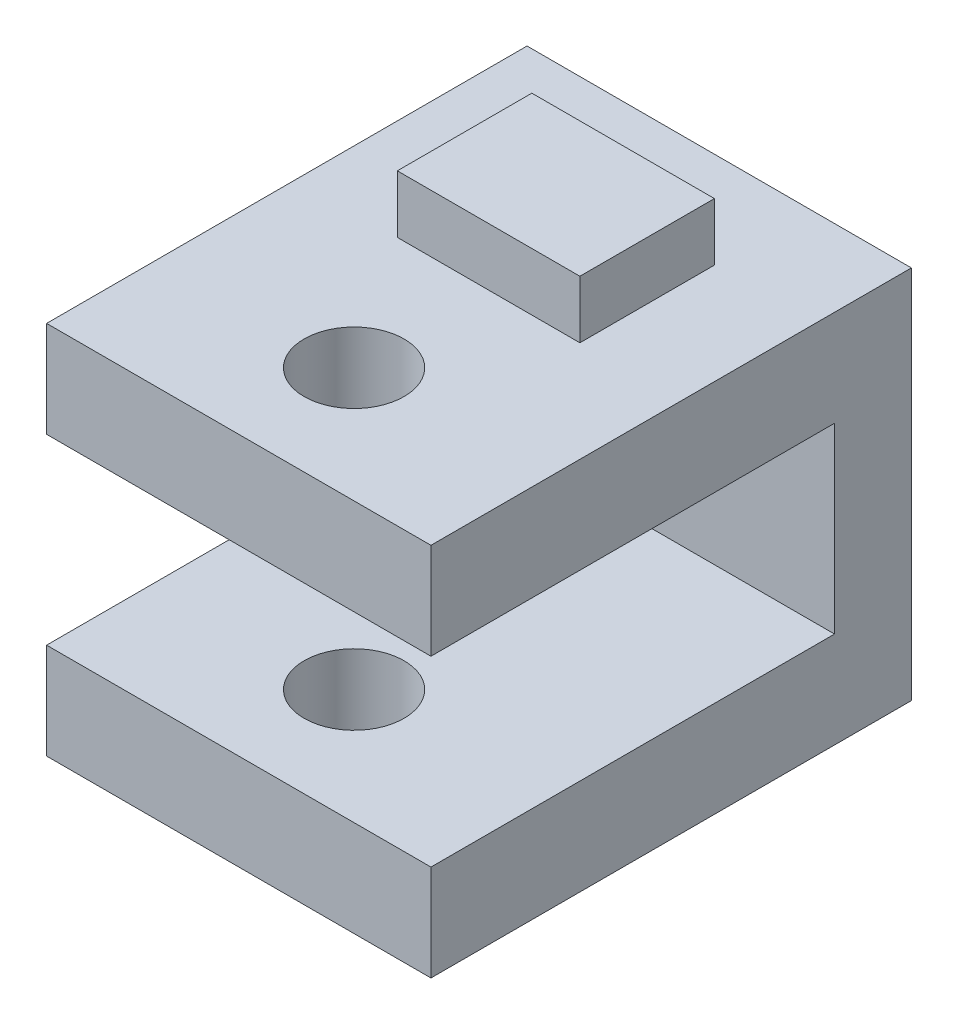
ISO-10303-21;
HEADER;
FILE_DESCRIPTION(('STEP AP214'),'2;1');
FILE_NAME('part.step','',(''),(''),'','','');
FILE_SCHEMA(('AUTOMOTIVE_DESIGN { 1 0 10303 214 1 1 1 1 }'));
ENDSEC;
DATA;
#1=APPLICATION_CONTEXT('core data for automotive mechanical design processes');
#2=APPLICATION_PROTOCOL_DEFINITION('international standard','automotive_design',2000,#1);
#3=PRODUCT_CONTEXT('',#1,'mechanical');
#4=PRODUCT('Part','Part','',(#3));
#5=PRODUCT_RELATED_PRODUCT_CATEGORY('part','',(#4));
#6=PRODUCT_DEFINITION_FORMATION('','',#4);
#7=PRODUCT_DEFINITION_CONTEXT('part definition',#1,'design');
#8=PRODUCT_DEFINITION('design','',#6,#7);
#9=PRODUCT_DEFINITION_SHAPE('','',#8);
#10=(LENGTH_UNIT() NAMED_UNIT(*) SI_UNIT(.MILLI.,.METRE.));
#11=(NAMED_UNIT(*) PLANE_ANGLE_UNIT() SI_UNIT($,.RADIAN.));
#12=(NAMED_UNIT(*) SI_UNIT($,.STERADIAN.) SOLID_ANGLE_UNIT());
#13=UNCERTAINTY_MEASURE_WITH_UNIT(LENGTH_MEASURE(1.E-05),#10,'distance_accuracy_value','');
#14=(GEOMETRIC_REPRESENTATION_CONTEXT(3) GLOBAL_UNCERTAINTY_ASSIGNED_CONTEXT((#13)) GLOBAL_UNIT_ASSIGNED_CONTEXT((#10,
#11,#12)) REPRESENTATION_CONTEXT('',''));
#15=CARTESIAN_POINT('',(0.,0.,0.));
#16=DIRECTION('',(0.,0.,1.));
#17=DIRECTION('',(1.,0.,0.));
#18=AXIS2_PLACEMENT_3D('',#15,#16,#17);
#19=CARTESIAN_POINT('',(-10.,-9.75,4.));
#20=DIRECTION('',(0.,1.,0.));
#21=DIRECTION('',(0.,0.,1.));
#22=AXIS2_PLACEMENT_3D('',#19,#20,#21);
#23=PLANE('',#22);
#24=CARTESIAN_POINT('',(0.,-9.75,19.));
#25=DIRECTION('',(0.,1.,0.));
#26=DIRECTION('',(0.,0.,1.));
#27=AXIS2_PLACEMENT_3D('',#24,#25,#26);
#28=CIRCLE('',#27,2.6);
#29=CARTESIAN_POINT('',(0.,-9.75,21.6));
#30=VERTEX_POINT('',#29);
#31=EDGE_CURVE('E309',#30,#30,#28,.T.);
#32=ORIENTED_EDGE('',*,*,#31,.T.);
#33=EDGE_LOOP('',(#32));
#34=FACE_BOUND('',#33,.T.);
#35=DIRECTION('',(1.,0.,0.));
#36=VECTOR('',#35,1.);
#37=CARTESIAN_POINT('',(-10.,-9.75,0.));
#38=LINE('',#37,#36);
#39=CARTESIAN_POINT('',(-10.,-9.75,0.));
#40=VERTEX_POINT('',#39);
#41=CARTESIAN_POINT('',(10.,-9.75,0.));
#42=VERTEX_POINT('',#41);
#43=EDGE_CURVE('E261',#40,#42,#38,.T.);
#44=ORIENTED_EDGE('',*,*,#43,.T.);
#45=DIRECTION('',(0.,0.,-1.));
#46=VECTOR('',#45,1.);
#47=CARTESIAN_POINT('',(10.,-9.75,4.));
#48=LINE('',#47,#46);
#49=CARTESIAN_POINT('',(10.,-9.75,25.));
#50=VERTEX_POINT('',#49);
#51=EDGE_CURVE('E48',#50,#42,#48,.T.);
#52=ORIENTED_EDGE('',*,*,#51,.F.);
#53=DIRECTION('',(1.,0.,0.));
#54=VECTOR('',#53,1.);
#55=CARTESIAN_POINT('',(10.,-9.75,25.));
#56=LINE('',#55,#54);
#57=CARTESIAN_POINT('',(-10.,-9.75,25.));
#58=VERTEX_POINT('',#57);
#59=EDGE_CURVE('E218',#58,#50,#56,.T.);
#60=ORIENTED_EDGE('',*,*,#59,.F.);
#61=DIRECTION('',(0.,0.,-1.));
#62=VECTOR('',#61,1.);
#63=CARTESIAN_POINT('',(-10.,-9.75,4.));
#64=LINE('',#63,#62);
#65=EDGE_CURVE('E11',#58,#40,#64,.T.);
#66=ORIENTED_EDGE('',*,*,#65,.T.);
#67=EDGE_LOOP('',(#44,#52,#60,#66));
#68=FACE_BOUND('',#67,.T.);
#69=DIRECTION('',(0.,0.,1.));
#70=VECTOR('',#69,1.);
#71=CARTESIAN_POINT('',(4.75,-9.75,5.));
#72=LINE('',#71,#70);
#73=CARTESIAN_POINT('',(4.75,-9.75,5.));
#74=VERTEX_POINT('',#73);
#75=CARTESIAN_POINT('',(4.75,-9.75,12.));
#76=VERTEX_POINT('',#75);
#77=EDGE_CURVE('E173',#74,#76,#72,.T.);
#78=ORIENTED_EDGE('',*,*,#77,.F.);
#79=DIRECTION('',(1.,0.,0.));
#80=VECTOR('',#79,1.);
#81=CARTESIAN_POINT('',(4.75,-9.75,5.));
#82=LINE('',#81,#80);
#83=CARTESIAN_POINT('',(-4.75,-9.75,5.));
#84=VERTEX_POINT('',#83);
#85=EDGE_CURVE('E170',#84,#74,#82,.T.);
#86=ORIENTED_EDGE('',*,*,#85,.F.);
#87=DIRECTION('',(0.,0.,-1.));
#88=VECTOR('',#87,1.);
#89=CARTESIAN_POINT('',(-4.75,-9.75,5.));
#90=LINE('',#89,#88);
#91=CARTESIAN_POINT('',(-4.75,-9.75,12.));
#92=VERTEX_POINT('',#91);
#93=EDGE_CURVE('E60',#92,#84,#90,.T.);
#94=ORIENTED_EDGE('',*,*,#93,.F.);
#95=DIRECTION('',(-1.,0.,0.));
#96=VECTOR('',#95,1.);
#97=CARTESIAN_POINT('',(4.75,-9.75,12.));
#98=LINE('',#97,#96);
#99=EDGE_CURVE('E55',#76,#92,#98,.T.);
#100=ORIENTED_EDGE('',*,*,#99,.F.);
#101=EDGE_LOOP('',(#78,#86,#94,#100));
#102=FACE_BOUND('',#101,.T.);
#103=ADVANCED_FACE('F39',(#34,#68,#102),#23,.F.);
#104=CARTESIAN_POINT('',(-10.,9.75,4.));
#105=DIRECTION('',(0.,-1.,0.));
#106=DIRECTION('',(0.,0.,-1.));
#107=AXIS2_PLACEMENT_3D('',#104,#105,#106);
#108=PLANE('',#107);
#109=CARTESIAN_POINT('',(0.,9.75,19.));
#110=DIRECTION('',(0.,1.,0.));
#111=DIRECTION('',(0.,0.,1.));
#112=AXIS2_PLACEMENT_3D('',#109,#110,#111);
#113=CIRCLE('',#112,2.6);
#114=CARTESIAN_POINT('',(0.,9.75,21.6));
#115=VERTEX_POINT('',#114);
#116=EDGE_CURVE('E328',#115,#115,#113,.T.);
#117=ORIENTED_EDGE('',*,*,#116,.F.);
#118=EDGE_LOOP('',(#117));
#119=FACE_BOUND('',#118,.T.);
#120=DIRECTION('',(-1.,0.,0.));
#121=VECTOR('',#120,1.);
#122=CARTESIAN_POINT('',(-10.,9.75,0.));
#123=LINE('',#122,#121);
#124=CARTESIAN_POINT('',(10.,9.75,0.));
#125=VERTEX_POINT('',#124);
#126=CARTESIAN_POINT('',(-10.,9.75,0.));
#127=VERTEX_POINT('',#126);
#128=EDGE_CURVE('E256',#125,#127,#123,.T.);
#129=ORIENTED_EDGE('',*,*,#128,.T.);
#130=DIRECTION('',(0.,0.,-1.));
#131=VECTOR('',#130,1.);
#132=CARTESIAN_POINT('',(-10.,9.75,4.));
#133=LINE('',#132,#131);
#134=CARTESIAN_POINT('',(-10.,9.75,25.));
#135=VERTEX_POINT('',#134);
#136=EDGE_CURVE('E258',#135,#127,#133,.T.);
#137=ORIENTED_EDGE('',*,*,#136,.F.);
#138=DIRECTION('',(-1.,0.,0.));
#139=VECTOR('',#138,1.);
#140=CARTESIAN_POINT('',(-10.,9.75,25.));
#141=LINE('',#140,#139);
#142=CARTESIAN_POINT('',(10.,9.75,25.));
#143=VERTEX_POINT('',#142);
#144=EDGE_CURVE('E241',#143,#135,#141,.T.);
#145=ORIENTED_EDGE('',*,*,#144,.F.);
#146=DIRECTION('',(0.,0.,-1.));
#147=VECTOR('',#146,1.);
#148=CARTESIAN_POINT('',(10.,9.75,4.));
#149=LINE('',#148,#147);
#150=EDGE_CURVE('E268',#143,#125,#149,.T.);
#151=ORIENTED_EDGE('',*,*,#150,.T.);
#152=EDGE_LOOP('',(#129,#137,#145,#151));
#153=FACE_BOUND('',#152,.T.);
#154=DIRECTION('',(0.,0.,1.));
#155=VECTOR('',#154,1.);
#156=CARTESIAN_POINT('',(-4.75,9.75,5.));
#157=LINE('',#156,#155);
#158=CARTESIAN_POINT('',(-4.75,9.75,5.));
#159=VERTEX_POINT('',#158);
#160=CARTESIAN_POINT('',(-4.75,9.75,12.));
#161=VERTEX_POINT('',#160);
#162=EDGE_CURVE('E174',#159,#161,#157,.T.);
#163=ORIENTED_EDGE('',*,*,#162,.F.);
#164=DIRECTION('',(-1.,0.,0.));
#165=VECTOR('',#164,1.);
#166=CARTESIAN_POINT('',(-4.75,9.75,5.));
#167=LINE('',#166,#165);
#168=CARTESIAN_POINT('',(4.75,9.75,5.));
#169=VERTEX_POINT('',#168);
#170=EDGE_CURVE('E187',#169,#159,#167,.T.);
#171=ORIENTED_EDGE('',*,*,#170,.F.);
#172=DIRECTION('',(0.,0.,-1.));
#173=VECTOR('',#172,1.);
#174=CARTESIAN_POINT('',(4.75,9.75,5.));
#175=LINE('',#174,#173);
#176=CARTESIAN_POINT('',(4.75,9.75,12.));
#177=VERTEX_POINT('',#176);
#178=EDGE_CURVE('E196',#177,#169,#175,.T.);
#179=ORIENTED_EDGE('',*,*,#178,.F.);
#180=DIRECTION('',(1.,0.,0.));
#181=VECTOR('',#180,1.);
#182=CARTESIAN_POINT('',(-4.75,9.75,12.));
#183=LINE('',#182,#181);
#184=EDGE_CURVE('E177',#161,#177,#183,.T.);
#185=ORIENTED_EDGE('',*,*,#184,.F.);
#186=EDGE_LOOP('',(#163,#171,#179,#185));
#187=FACE_BOUND('',#186,.T.);
#188=ADVANCED_FACE('F284',(#119,#153,#187),#108,.F.);
#189=CARTESIAN_POINT('',(0.,0.,4.));
#190=DIRECTION('',(0.,0.,1.));
#191=DIRECTION('',(1.,0.,0.));
#192=AXIS2_PLACEMENT_3D('',#189,#190,#191);
#193=PLANE('',#192);
#194=CARTESIAN_POINT('',(0.,0.,4.));
#195=DIRECTION('',(0.,0.,1.));
#196=DIRECTION('',(1.,0.,0.));
#197=AXIS2_PLACEMENT_3D('',#194,#195,#196);
#198=CIRCLE('',#197,2.6);
#199=CARTESIAN_POINT('',(2.6,0.,4.));
#200=VERTEX_POINT('',#199);
#201=EDGE_CURVE('E331',#200,#200,#198,.T.);
#202=ORIENTED_EDGE('',*,*,#201,.F.);
#203=EDGE_LOOP('',(#202));
#204=FACE_BOUND('',#203,.T.);
#205=DIRECTION('',(0.,-1.,0.));
#206=VECTOR('',#205,1.);
#207=CARTESIAN_POINT('',(-10.,9.75,4.));
#208=LINE('',#207,#206);
#209=CARTESIAN_POINT('',(-10.,4.75,4.));
#210=VERTEX_POINT('',#209);
#211=CARTESIAN_POINT('',(-10.,-4.75,4.));
#212=VERTEX_POINT('',#211);
#213=EDGE_CURVE('E253',#210,#212,#208,.T.);
#214=ORIENTED_EDGE('',*,*,#213,.T.);
#215=DIRECTION('',(-1.,0.,0.));
#216=VECTOR('',#215,1.);
#217=CARTESIAN_POINT('',(10.,-4.75,4.));
#218=LINE('',#217,#216);
#219=CARTESIAN_POINT('',(10.,-4.75,4.));
#220=VERTEX_POINT('',#219);
#221=EDGE_CURVE('E219',#220,#212,#218,.T.);
#222=ORIENTED_EDGE('',*,*,#221,.F.);
#223=DIRECTION('',(0.,1.,0.));
#224=VECTOR('',#223,1.);
#225=CARTESIAN_POINT('',(10.,9.75,4.));
#226=LINE('',#225,#224);
#227=CARTESIAN_POINT('',(10.,4.75,4.));
#228=VERTEX_POINT('',#227);
#229=EDGE_CURVE('E255',#220,#228,#226,.T.);
#230=ORIENTED_EDGE('',*,*,#229,.T.);
#231=DIRECTION('',(1.,0.,0.));
#232=VECTOR('',#231,1.);
#233=CARTESIAN_POINT('',(-10.,4.75,4.));
#234=LINE('',#233,#232);
#235=EDGE_CURVE('E222',#210,#228,#234,.T.);
#236=ORIENTED_EDGE('',*,*,#235,.F.);
#237=EDGE_LOOP('',(#214,#222,#230,#236));
#238=FACE_BOUND('',#237,.T.);
#239=ADVANCED_FACE('F299',(#204,#238),#193,.T.);
#240=CARTESIAN_POINT('',(-10.,9.75,4.));
#241=DIRECTION('',(1.,0.,0.));
#242=DIRECTION('',(0.,0.,-1.));
#243=AXIS2_PLACEMENT_3D('',#240,#241,#242);
#244=PLANE('',#243);
#245=DIRECTION('',(0.,-1.,0.));
#246=VECTOR('',#245,1.);
#247=CARTESIAN_POINT('',(-10.,9.75,0.));
#248=LINE('',#247,#246);
#249=EDGE_CURVE('E252',#127,#40,#248,.T.);
#250=ORIENTED_EDGE('',*,*,#249,.T.);
#251=ORIENTED_EDGE('',*,*,#65,.F.);
#252=DIRECTION('',(0.,-1.,0.));
#253=VECTOR('',#252,1.);
#254=CARTESIAN_POINT('',(-10.,-9.75,25.));
#255=LINE('',#254,#253);
#256=CARTESIAN_POINT('',(-10.,-4.75,25.));
#257=VERTEX_POINT('',#256);
#258=EDGE_CURVE('E226',#257,#58,#255,.T.);
#259=ORIENTED_EDGE('',*,*,#258,.F.);
#260=DIRECTION('',(0.,0.,-1.));
#261=VECTOR('',#260,1.);
#262=CARTESIAN_POINT('',(-10.,-4.75,25.));
#263=LINE('',#262,#261);
#264=EDGE_CURVE('E215',#257,#212,#263,.T.);
#265=ORIENTED_EDGE('',*,*,#264,.T.);
#266=ORIENTED_EDGE('',*,*,#213,.F.);
#267=DIRECTION('',(0.,0.,-1.));
#268=VECTOR('',#267,1.);
#269=CARTESIAN_POINT('',(-10.,4.75,25.));
#270=LINE('',#269,#268);
#271=CARTESIAN_POINT('',(-10.,4.75,25.));
#272=VERTEX_POINT('',#271);
#273=EDGE_CURVE('E249',#272,#210,#270,.T.);
#274=ORIENTED_EDGE('',*,*,#273,.F.);
#275=DIRECTION('',(0.,-1.,0.));
#276=VECTOR('',#275,1.);
#277=CARTESIAN_POINT('',(-10.,9.75,25.));
#278=LINE('',#277,#276);
#279=EDGE_CURVE('E233',#135,#272,#278,.T.);
#280=ORIENTED_EDGE('',*,*,#279,.F.);
#281=ORIENTED_EDGE('',*,*,#136,.T.);
#282=EDGE_LOOP('',(#250,#251,#259,#265,#266,#274,#280,#281));
#283=FACE_BOUND('',#282,.T.);
#284=ADVANCED_FACE('F41',(#283),#244,.F.);
#285=CARTESIAN_POINT('',(10.,9.75,4.));
#286=DIRECTION('',(-1.,0.,0.));
#287=DIRECTION('',(0.,0.,1.));
#288=AXIS2_PLACEMENT_3D('',#285,#286,#287);
#289=PLANE('',#288);
#290=DIRECTION('',(0.,1.,0.));
#291=VECTOR('',#290,1.);
#292=CARTESIAN_POINT('',(10.,9.75,0.));
#293=LINE('',#292,#291);
#294=EDGE_CURVE('E263',#42,#125,#293,.T.);
#295=ORIENTED_EDGE('',*,*,#294,.T.);
#296=ORIENTED_EDGE('',*,*,#150,.F.);
#297=DIRECTION('',(0.,1.,0.));
#298=VECTOR('',#297,1.);
#299=CARTESIAN_POINT('',(10.,9.75,25.));
#300=LINE('',#299,#298);
#301=CARTESIAN_POINT('',(10.,4.75,25.));
#302=VERTEX_POINT('',#301);
#303=EDGE_CURVE('E238',#302,#143,#300,.T.);
#304=ORIENTED_EDGE('',*,*,#303,.F.);
#305=DIRECTION('',(0.,0.,-1.));
#306=VECTOR('',#305,1.);
#307=CARTESIAN_POINT('',(10.,4.75,25.));
#308=LINE('',#307,#306);
#309=EDGE_CURVE('E244',#302,#228,#308,.T.);
#310=ORIENTED_EDGE('',*,*,#309,.T.);
#311=ORIENTED_EDGE('',*,*,#229,.F.);
#312=DIRECTION('',(0.,0.,-1.));
#313=VECTOR('',#312,1.);
#314=CARTESIAN_POINT('',(10.,-4.75,25.));
#315=LINE('',#314,#313);
#316=CARTESIAN_POINT('',(10.,-4.75,25.));
#317=VERTEX_POINT('',#316);
#318=EDGE_CURVE('E212',#317,#220,#315,.T.);
#319=ORIENTED_EDGE('',*,*,#318,.F.);
#320=DIRECTION('',(0.,1.,0.));
#321=VECTOR('',#320,1.);
#322=CARTESIAN_POINT('',(10.,-9.75,25.));
#323=LINE('',#322,#321);
#324=EDGE_CURVE('E223',#50,#317,#323,.T.);
#325=ORIENTED_EDGE('',*,*,#324,.F.);
#326=ORIENTED_EDGE('',*,*,#51,.T.);
#327=EDGE_LOOP('',(#295,#296,#304,#310,#311,#319,#325,#326));
#328=FACE_BOUND('',#327,.T.);
#329=ADVANCED_FACE('F275',(#328),#289,.F.);
#330=CARTESIAN_POINT('',(0.,0.,0.));
#331=DIRECTION('',(0.,0.,1.));
#332=DIRECTION('',(1.,0.,0.));
#333=AXIS2_PLACEMENT_3D('',#330,#331,#332);
#334=PLANE('',#333);
#335=CARTESIAN_POINT('',(0.,0.,0.));
#336=DIRECTION('',(0.,0.,-1.));
#337=DIRECTION('',(-1.,0.,0.));
#338=AXIS2_PLACEMENT_3D('',#335,#336,#337);
#339=CIRCLE('',#338,2.6);
#340=CARTESIAN_POINT('',(-2.6,0.,0.));
#341=VERTEX_POINT('',#340);
#342=EDGE_CURVE('E334',#341,#341,#339,.T.);
#343=ORIENTED_EDGE('',*,*,#342,.F.);
#344=EDGE_LOOP('',(#343));
#345=FACE_BOUND('',#344,.T.);
#346=ORIENTED_EDGE('',*,*,#249,.F.);
#347=ORIENTED_EDGE('',*,*,#128,.F.);
#348=ORIENTED_EDGE('',*,*,#294,.F.);
#349=ORIENTED_EDGE('',*,*,#43,.F.);
#350=EDGE_LOOP('',(#346,#347,#348,#349));
#351=FACE_BOUND('',#350,.T.);
#352=ADVANCED_FACE('F282',(#345,#351),#334,.F.);
#353=CARTESIAN_POINT('',(-10.,4.75,25.));
#354=DIRECTION('',(0.,1.,0.));
#355=DIRECTION('',(0.,0.,1.));
#356=AXIS2_PLACEMENT_3D('',#353,#354,#355);
#357=PLANE('',#356);
#358=CARTESIAN_POINT('',(0.,4.75,19.));
#359=DIRECTION('',(0.,1.,0.));
#360=DIRECTION('',(0.,0.,1.));
#361=AXIS2_PLACEMENT_3D('',#358,#359,#360);
#362=CIRCLE('',#361,2.6);
#363=CARTESIAN_POINT('',(0.,4.74999999999999,21.6));
#364=VERTEX_POINT('',#363);
#365=EDGE_CURVE('E325',#364,#364,#362,.T.);
#366=ORIENTED_EDGE('',*,*,#365,.T.);
#367=EDGE_LOOP('',(#366));
#368=FACE_BOUND('',#367,.T.);
#369=ORIENTED_EDGE('',*,*,#235,.T.);
#370=ORIENTED_EDGE('',*,*,#309,.F.);
#371=DIRECTION('',(1.,0.,0.));
#372=VECTOR('',#371,1.);
#373=CARTESIAN_POINT('',(-10.,4.75,25.));
#374=LINE('',#373,#372);
#375=EDGE_CURVE('E236',#272,#302,#374,.T.);
#376=ORIENTED_EDGE('',*,*,#375,.F.);
#377=ORIENTED_EDGE('',*,*,#273,.T.);
#378=EDGE_LOOP('',(#369,#370,#376,#377));
#379=FACE_BOUND('',#378,.T.);
#380=ADVANCED_FACE('F297',(#368,#379),#357,.F.);
#381=CARTESIAN_POINT('',(0.,0.,25.));
#382=DIRECTION('',(0.,0.,1.));
#383=DIRECTION('',(1.,0.,0.));
#384=AXIS2_PLACEMENT_3D('',#381,#382,#383);
#385=PLANE('',#384);
#386=ORIENTED_EDGE('',*,*,#279,.T.);
#387=ORIENTED_EDGE('',*,*,#375,.T.);
#388=ORIENTED_EDGE('',*,*,#303,.T.);
#389=ORIENTED_EDGE('',*,*,#144,.T.);
#390=EDGE_LOOP('',(#386,#387,#388,#389));
#391=FACE_BOUND('',#390,.T.);
#392=ADVANCED_FACE('F292',(#391),#385,.T.);
#393=CARTESIAN_POINT('',(10.,-4.75,25.));
#394=DIRECTION('',(0.,-1.,0.));
#395=DIRECTION('',(1.,0.,0.));
#396=AXIS2_PLACEMENT_3D('',#393,#394,#395);
#397=PLANE('',#396);
#398=CARTESIAN_POINT('',(0.,-4.75,19.));
#399=DIRECTION('',(0.,-1.,0.));
#400=DIRECTION('',(1.,0.,0.));
#401=AXIS2_PLACEMENT_3D('',#398,#399,#400);
#402=CIRCLE('',#401,2.6);
#403=CARTESIAN_POINT('',(0.,-4.75,21.6));
#404=VERTEX_POINT('',#403);
#405=EDGE_CURVE('E43',#404,#404,#402,.T.);
#406=ORIENTED_EDGE('',*,*,#405,.T.);
#407=EDGE_LOOP('',(#406));
#408=FACE_BOUND('',#407,.T.);
#409=ORIENTED_EDGE('',*,*,#221,.T.);
#410=ORIENTED_EDGE('',*,*,#264,.F.);
#411=DIRECTION('',(-1.,0.,0.));
#412=VECTOR('',#411,1.);
#413=CARTESIAN_POINT('',(10.,-4.75,25.));
#414=LINE('',#413,#412);
#415=EDGE_CURVE('E229',#317,#257,#414,.T.);
#416=ORIENTED_EDGE('',*,*,#415,.F.);
#417=ORIENTED_EDGE('',*,*,#318,.T.);
#418=EDGE_LOOP('',(#409,#410,#416,#417));
#419=FACE_BOUND('',#418,.T.);
#420=ADVANCED_FACE('F303',(#408,#419),#397,.F.);
#421=CARTESIAN_POINT('',(0.,0.,25.));
#422=DIRECTION('',(0.,0.,1.));
#423=DIRECTION('',(1.,0.,0.));
#424=AXIS2_PLACEMENT_3D('',#421,#422,#423);
#425=PLANE('',#424);
#426=ORIENTED_EDGE('',*,*,#324,.T.);
#427=ORIENTED_EDGE('',*,*,#415,.T.);
#428=ORIENTED_EDGE('',*,*,#258,.T.);
#429=ORIENTED_EDGE('',*,*,#59,.T.);
#430=EDGE_LOOP('',(#426,#427,#428,#429));
#431=FACE_BOUND('',#430,.T.);
#432=ADVANCED_FACE('F305',(#431),#425,.T.);
#433=CARTESIAN_POINT('',(-4.75,12.75,5.));
#434=DIRECTION('',(1.,0.,0.));
#435=DIRECTION('',(0.,0.,-1.));
#436=AXIS2_PLACEMENT_3D('',#433,#434,#435);
#437=PLANE('',#436);
#438=ORIENTED_EDGE('',*,*,#162,.T.);
#439=DIRECTION('',(0.,-1.,0.));
#440=VECTOR('',#439,1.);
#441=CARTESIAN_POINT('',(-4.75,12.75,12.));
#442=LINE('',#441,#440);
#443=CARTESIAN_POINT('',(-4.75,12.75,12.));
#444=VERTEX_POINT('',#443);
#445=EDGE_CURVE('E209',#444,#161,#442,.T.);
#446=ORIENTED_EDGE('',*,*,#445,.F.);
#447=DIRECTION('',(0.,0.,1.));
#448=VECTOR('',#447,1.);
#449=CARTESIAN_POINT('',(-4.75,12.75,5.));
#450=LINE('',#449,#448);
#451=CARTESIAN_POINT('',(-4.75,12.75,5.));
#452=VERTEX_POINT('',#451);
#453=EDGE_CURVE('E183',#452,#444,#450,.T.);
#454=ORIENTED_EDGE('',*,*,#453,.F.);
#455=DIRECTION('',(0.,-1.,0.));
#456=VECTOR('',#455,1.);
#457=CARTESIAN_POINT('',(-4.75,12.75,5.));
#458=LINE('',#457,#456);
#459=EDGE_CURVE('E192',#452,#159,#458,.T.);
#460=ORIENTED_EDGE('',*,*,#459,.T.);
#461=EDGE_LOOP('',(#438,#446,#454,#460));
#462=FACE_BOUND('',#461,.T.);
#463=ADVANCED_FACE('F400',(#462),#437,.F.);
#464=CARTESIAN_POINT('',(-4.75,12.75,12.));
#465=DIRECTION('',(0.,0.,-1.));
#466=DIRECTION('',(-1.,0.,0.));
#467=AXIS2_PLACEMENT_3D('',#464,#465,#466);
#468=PLANE('',#467);
#469=ORIENTED_EDGE('',*,*,#184,.T.);
#470=DIRECTION('',(0.,-1.,0.));
#471=VECTOR('',#470,1.);
#472=CARTESIAN_POINT('',(4.75,12.75,12.));
#473=LINE('',#472,#471);
#474=CARTESIAN_POINT('',(4.75,12.75,12.));
#475=VERTEX_POINT('',#474);
#476=EDGE_CURVE('E206',#475,#177,#473,.T.);
#477=ORIENTED_EDGE('',*,*,#476,.F.);
#478=DIRECTION('',(1.,0.,0.));
#479=VECTOR('',#478,1.);
#480=CARTESIAN_POINT('',(-4.75,12.75,12.));
#481=LINE('',#480,#479);
#482=EDGE_CURVE('E186',#444,#475,#481,.T.);
#483=ORIENTED_EDGE('',*,*,#482,.F.);
#484=ORIENTED_EDGE('',*,*,#445,.T.);
#485=EDGE_LOOP('',(#469,#477,#483,#484));
#486=FACE_BOUND('',#485,.T.);
#487=ADVANCED_FACE('F396',(#486),#468,.F.);
#488=CARTESIAN_POINT('',(4.75,12.75,5.));
#489=DIRECTION('',(-1.,0.,0.));
#490=DIRECTION('',(0.,0.,1.));
#491=AXIS2_PLACEMENT_3D('',#488,#489,#490);
#492=PLANE('',#491);
#493=ORIENTED_EDGE('',*,*,#178,.T.);
#494=DIRECTION('',(0.,-1.,0.));
#495=VECTOR('',#494,1.);
#496=CARTESIAN_POINT('',(4.75,12.75,5.));
#497=LINE('',#496,#495);
#498=CARTESIAN_POINT('',(4.75,12.75,5.));
#499=VERTEX_POINT('',#498);
#500=EDGE_CURVE('E203',#499,#169,#497,.T.);
#501=ORIENTED_EDGE('',*,*,#500,.F.);
#502=DIRECTION('',(0.,0.,-1.));
#503=VECTOR('',#502,1.);
#504=CARTESIAN_POINT('',(4.75,12.75,5.));
#505=LINE('',#504,#503);
#506=EDGE_CURVE('E189',#475,#499,#505,.T.);
#507=ORIENTED_EDGE('',*,*,#506,.F.);
#508=ORIENTED_EDGE('',*,*,#476,.T.);
#509=EDGE_LOOP('',(#493,#501,#507,#508));
#510=FACE_BOUND('',#509,.T.);
#511=ADVANCED_FACE('F392',(#510),#492,.F.);
#512=CARTESIAN_POINT('',(-4.75,12.75,5.));
#513=DIRECTION('',(0.,0.,1.));
#514=DIRECTION('',(1.,0.,0.));
#515=AXIS2_PLACEMENT_3D('',#512,#513,#514);
#516=PLANE('',#515);
#517=ORIENTED_EDGE('',*,*,#170,.T.);
#518=ORIENTED_EDGE('',*,*,#459,.F.);
#519=DIRECTION('',(-1.,0.,0.));
#520=VECTOR('',#519,1.);
#521=CARTESIAN_POINT('',(-4.75,12.75,5.));
#522=LINE('',#521,#520);
#523=EDGE_CURVE('E191',#499,#452,#522,.T.);
#524=ORIENTED_EDGE('',*,*,#523,.F.);
#525=ORIENTED_EDGE('',*,*,#500,.T.);
#526=EDGE_LOOP('',(#517,#518,#524,#525));
#527=FACE_BOUND('',#526,.T.);
#528=ADVANCED_FACE('F388',(#527),#516,.F.);
#529=CARTESIAN_POINT('',(0.,12.75,0.));
#530=DIRECTION('',(0.,1.,0.));
#531=DIRECTION('',(0.,0.,1.));
#532=AXIS2_PLACEMENT_3D('',#529,#530,#531);
#533=PLANE('',#532);
#534=ORIENTED_EDGE('',*,*,#453,.T.);
#535=ORIENTED_EDGE('',*,*,#482,.T.);
#536=ORIENTED_EDGE('',*,*,#506,.T.);
#537=ORIENTED_EDGE('',*,*,#523,.T.);
#538=EDGE_LOOP('',(#534,#535,#536,#537));
#539=FACE_BOUND('',#538,.T.);
#540=ADVANCED_FACE('F385',(#539),#533,.T.);
#541=CARTESIAN_POINT('',(4.75,-12.75,5.));
#542=DIRECTION('',(-1.,0.,0.));
#543=DIRECTION('',(0.,0.,1.));
#544=AXIS2_PLACEMENT_3D('',#541,#542,#543);
#545=PLANE('',#544);
#546=ORIENTED_EDGE('',*,*,#77,.T.);
#547=DIRECTION('',(0.,1.,0.));
#548=VECTOR('',#547,1.);
#549=CARTESIAN_POINT('',(4.75,-12.75,12.));
#550=LINE('',#549,#548);
#551=CARTESIAN_POINT('',(4.75,-12.75,12.));
#552=VERTEX_POINT('',#551);
#553=EDGE_CURVE('E154',#552,#76,#550,.T.);
#554=ORIENTED_EDGE('',*,*,#553,.F.);
#555=DIRECTION('',(0.,0.,1.));
#556=VECTOR('',#555,1.);
#557=CARTESIAN_POINT('',(4.75,-12.75,5.));
#558=LINE('',#557,#556);
#559=CARTESIAN_POINT('',(4.75,-12.75,5.));
#560=VERTEX_POINT('',#559);
#561=EDGE_CURVE('E161',#560,#552,#558,.T.);
#562=ORIENTED_EDGE('',*,*,#561,.F.);
#563=DIRECTION('',(0.,1.,0.));
#564=VECTOR('',#563,1.);
#565=CARTESIAN_POINT('',(4.75,-12.75,5.));
#566=LINE('',#565,#564);
#567=EDGE_CURVE('E314',#560,#74,#566,.T.);
#568=ORIENTED_EDGE('',*,*,#567,.T.);
#569=EDGE_LOOP('',(#546,#554,#562,#568));
#570=FACE_BOUND('',#569,.T.);
#571=ADVANCED_FACE('F172',(#570),#545,.F.);
#572=CARTESIAN_POINT('',(4.75,-12.75,12.));
#573=DIRECTION('',(0.,0.,-1.));
#574=DIRECTION('',(-1.,0.,0.));
#575=AXIS2_PLACEMENT_3D('',#572,#573,#574);
#576=PLANE('',#575);
#577=ORIENTED_EDGE('',*,*,#99,.T.);
#578=DIRECTION('',(0.,1.,0.));
#579=VECTOR('',#578,1.);
#580=CARTESIAN_POINT('',(-4.75,-12.75,12.));
#581=LINE('',#580,#579);
#582=CARTESIAN_POINT('',(-4.75,-12.75,12.));
#583=VERTEX_POINT('',#582);
#584=EDGE_CURVE('E157',#583,#92,#581,.T.);
#585=ORIENTED_EDGE('',*,*,#584,.F.);
#586=DIRECTION('',(-1.,0.,0.));
#587=VECTOR('',#586,1.);
#588=CARTESIAN_POINT('',(4.75,-12.75,12.));
#589=LINE('',#588,#587);
#590=EDGE_CURVE('E150',#552,#583,#589,.T.);
#591=ORIENTED_EDGE('',*,*,#590,.F.);
#592=ORIENTED_EDGE('',*,*,#553,.T.);
#593=EDGE_LOOP('',(#577,#585,#591,#592));
#594=FACE_BOUND('',#593,.T.);
#595=ADVANCED_FACE('F152',(#594),#576,.F.);
#596=CARTESIAN_POINT('',(-4.75,-12.75,5.));
#597=DIRECTION('',(1.,0.,0.));
#598=DIRECTION('',(0.,0.,-1.));
#599=AXIS2_PLACEMENT_3D('',#596,#597,#598);
#600=PLANE('',#599);
#601=ORIENTED_EDGE('',*,*,#93,.T.);
#602=DIRECTION('',(0.,1.,0.));
#603=VECTOR('',#602,1.);
#604=CARTESIAN_POINT('',(-4.75,-12.75,5.));
#605=LINE('',#604,#603);
#606=CARTESIAN_POINT('',(-4.75,-12.75,5.));
#607=VERTEX_POINT('',#606);
#608=EDGE_CURVE('E179',#607,#84,#605,.T.);
#609=ORIENTED_EDGE('',*,*,#608,.F.);
#610=DIRECTION('',(0.,0.,-1.));
#611=VECTOR('',#610,1.);
#612=CARTESIAN_POINT('',(-4.75,-12.75,5.));
#613=LINE('',#612,#611);
#614=EDGE_CURVE('E160',#583,#607,#613,.T.);
#615=ORIENTED_EDGE('',*,*,#614,.F.);
#616=ORIENTED_EDGE('',*,*,#584,.T.);
#617=EDGE_LOOP('',(#601,#609,#615,#616));
#618=FACE_BOUND('',#617,.T.);
#619=ADVANCED_FACE('F377',(#618),#600,.F.);
#620=CARTESIAN_POINT('',(4.75,-12.75,5.));
#621=DIRECTION('',(0.,0.,1.));
#622=DIRECTION('',(1.,0.,0.));
#623=AXIS2_PLACEMENT_3D('',#620,#621,#622);
#624=PLANE('',#623);
#625=ORIENTED_EDGE('',*,*,#85,.T.);
#626=ORIENTED_EDGE('',*,*,#567,.F.);
#627=DIRECTION('',(1.,0.,0.));
#628=VECTOR('',#627,1.);
#629=CARTESIAN_POINT('',(4.75,-12.75,5.));
#630=LINE('',#629,#628);
#631=EDGE_CURVE('E166',#607,#560,#630,.T.);
#632=ORIENTED_EDGE('',*,*,#631,.F.);
#633=ORIENTED_EDGE('',*,*,#608,.T.);
#634=EDGE_LOOP('',(#625,#626,#632,#633));
#635=FACE_BOUND('',#634,.T.);
#636=ADVANCED_FACE('F313',(#635),#624,.F.);
#637=CARTESIAN_POINT('',(0.,-12.75,0.));
#638=DIRECTION('',(0.,-1.,0.));
#639=DIRECTION('',(0.,0.,-1.));
#640=AXIS2_PLACEMENT_3D('',#637,#638,#639);
#641=PLANE('',#640);
#642=ORIENTED_EDGE('',*,*,#561,.T.);
#643=ORIENTED_EDGE('',*,*,#590,.T.);
#644=ORIENTED_EDGE('',*,*,#614,.T.);
#645=ORIENTED_EDGE('',*,*,#631,.T.);
#646=EDGE_LOOP('',(#642,#643,#644,#645));
#647=FACE_BOUND('',#646,.T.);
#648=ADVANCED_FACE('F164',(#647),#641,.T.);
#649=CARTESIAN_POINT('',(0.,-12.75,19.));
#650=DIRECTION('',(0.,1.,0.));
#651=DIRECTION('',(0.,0.,1.));
#652=AXIS2_PLACEMENT_3D('',#649,#650,#651);
#653=CYLINDRICAL_SURFACE('',#652,2.6);
#654=CARTESIAN_POINT('',(0.,-4.75,21.6));
#655=CARTESIAN_POINT('',(0.,-4.80208333333333,21.6));
#656=CARTESIAN_POINT('',(0.,-4.85416666666667,21.6));
#657=CARTESIAN_POINT('',(0.,-4.95833333333333,21.6));
#658=CARTESIAN_POINT('',(0.,-5.01041666666667,21.6));
#659=CARTESIAN_POINT('',(0.,-5.11458333333333,21.6));
#660=CARTESIAN_POINT('',(0.,-5.16666666666667,21.6));
#661=CARTESIAN_POINT('',(0.,-5.27083333333333,21.6));
#662=CARTESIAN_POINT('',(0.,-5.32291666666667,21.6));
#663=CARTESIAN_POINT('',(0.,-5.42708333333333,21.6));
#664=CARTESIAN_POINT('',(0.,-5.47916666666667,21.6));
#665=CARTESIAN_POINT('',(0.,-5.58333333333333,21.6));
#666=CARTESIAN_POINT('',(0.,-5.63541666666667,21.6));
#667=CARTESIAN_POINT('',(0.,-5.73958333333333,21.6));
#668=CARTESIAN_POINT('',(0.,-5.79166666666667,21.6));
#669=CARTESIAN_POINT('',(0.,-5.89583333333333,21.6));
#670=CARTESIAN_POINT('',(0.,-5.94791666666667,21.6));
#671=CARTESIAN_POINT('',(0.,-6.05208333333333,21.6));
#672=CARTESIAN_POINT('',(0.,-6.10416666666667,21.6));
#673=CARTESIAN_POINT('',(0.,-6.20833333333333,21.6));
#674=CARTESIAN_POINT('',(0.,-6.26041666666667,21.6));
#675=CARTESIAN_POINT('',(0.,-6.36458333333333,21.6));
#676=CARTESIAN_POINT('',(0.,-6.41666666666667,21.6));
#677=CARTESIAN_POINT('',(0.,-6.52083333333333,21.6));
#678=CARTESIAN_POINT('',(0.,-6.57291666666667,21.6));
#679=CARTESIAN_POINT('',(0.,-6.67708333333333,21.6));
#680=CARTESIAN_POINT('',(0.,-6.72916666666667,21.6));
#681=CARTESIAN_POINT('',(0.,-6.83333333333333,21.6));
#682=CARTESIAN_POINT('',(0.,-6.88541666666667,21.6));
#683=CARTESIAN_POINT('',(0.,-6.98958333333333,21.6));
#684=CARTESIAN_POINT('',(0.,-7.04166666666667,21.6));
#685=CARTESIAN_POINT('',(0.,-7.14583333333333,21.6));
#686=CARTESIAN_POINT('',(0.,-7.19791666666667,21.6));
#687=CARTESIAN_POINT('',(0.,-7.30208333333333,21.6));
#688=CARTESIAN_POINT('',(0.,-7.35416666666667,21.6));
#689=CARTESIAN_POINT('',(0.,-7.45833333333333,21.6));
#690=CARTESIAN_POINT('',(0.,-7.51041666666667,21.6));
#691=CARTESIAN_POINT('',(0.,-7.61458333333333,21.6));
#692=CARTESIAN_POINT('',(0.,-7.66666666666667,21.6));
#693=CARTESIAN_POINT('',(0.,-7.77083333333333,21.6));
#694=CARTESIAN_POINT('',(0.,-7.82291666666667,21.6));
#695=CARTESIAN_POINT('',(0.,-7.92708333333333,21.6));
#696=CARTESIAN_POINT('',(0.,-7.97916666666667,21.6));
#697=CARTESIAN_POINT('',(0.,-8.08333333333333,21.6));
#698=CARTESIAN_POINT('',(0.,-8.13541666666667,21.6));
#699=CARTESIAN_POINT('',(0.,-8.23958333333333,21.6));
#700=CARTESIAN_POINT('',(0.,-8.29166666666667,21.6));
#701=CARTESIAN_POINT('',(0.,-8.39583333333333,21.6));
#702=CARTESIAN_POINT('',(0.,-8.44791666666667,21.6));
#703=CARTESIAN_POINT('',(0.,-8.55208333333333,21.6));
#704=CARTESIAN_POINT('',(0.,-8.60416666666667,21.6));
#705=CARTESIAN_POINT('',(0.,-8.70833333333333,21.6));
#706=CARTESIAN_POINT('',(0.,-8.76041666666667,21.6));
#707=CARTESIAN_POINT('',(0.,-8.86458333333333,21.6));
#708=CARTESIAN_POINT('',(0.,-8.91666666666667,21.6));
#709=CARTESIAN_POINT('',(0.,-9.02083333333333,21.6));
#710=CARTESIAN_POINT('',(0.,-9.07291666666667,21.6));
#711=CARTESIAN_POINT('',(0.,-9.17708333333333,21.6));
#712=CARTESIAN_POINT('',(0.,-9.22916666666667,21.6));
#713=CARTESIAN_POINT('',(0.,-9.33333333333333,21.6));
#714=CARTESIAN_POINT('',(0.,-9.38541666666667,21.6));
#715=CARTESIAN_POINT('',(0.,-9.48958333333333,21.6));
#716=CARTESIAN_POINT('',(0.,-9.54166666666667,21.6));
#717=CARTESIAN_POINT('',(0.,-9.64583333333333,21.6));
#718=CARTESIAN_POINT('',(0.,-9.69791666666667,21.6));
#719=CARTESIAN_POINT('',(0.,-9.75,21.6));
#720=B_SPLINE_CURVE_WITH_KNOTS('',3,(#654,#655,#656,#657,#658,#659,#660,#661,#662,#663,#664,
#665,#666,#667,#668,#669,#670,#671,#672,#673,#674,#675,#676,#677,#678,#679,#680,#681,#682,#683,
#684,#685,#686,#687,#688,#689,#690,#691,#692,#693,#694,#695,#696,#697,#698,#699,#700,#701,#702,
#703,#704,#705,#706,#707,#708,#709,#710,#711,#712,#713,#714,#715,#716,#717,#718,#719),
.UNSPECIFIED.,.F.,.F.,(4,2,2,2,2,2,2,2,2,2,2,2,2,2,2,2,2,2,2,2,2,2,2,2,2,2,2,2,2,2,2,2,4),(0.,
0.15625,0.312499999999999,0.46875,0.625,0.781249999999999,0.937499999999999,1.09375,1.25,
1.40625,1.5625,1.71875,1.875,2.03125,2.1875,2.34375,2.5,2.65625,2.8125,2.96875,3.125,3.28125,
3.4375,3.59375,3.75,3.90625,4.0625,4.21875,4.375,4.53125,4.6875,4.84375,5.),.UNSPECIFIED.);
#721=EDGE_CURVE('BSEAM363',#404,#30,#720,.T.);
#722=ORIENTED_EDGE('',*,*,#405,.F.);
#723=ORIENTED_EDGE('',*,*,#31,.F.);
#724=ORIENTED_EDGE('',*,*,#721,.T.);
#725=ORIENTED_EDGE('',*,*,#721,.F.);
#726=EDGE_LOOP('',(#722,#724,#723,#725));
#727=FACE_BOUND('',#726,.T.);
#728=ADVANCED_FACE('F363',(#727),#653,.F.);
#729=CARTESIAN_POINT('',(0.,9.75,21.6));
#730=CARTESIAN_POINT('',(0.,9.69791666666666,21.6));
#731=CARTESIAN_POINT('',(0.,9.64583333333333,21.6));
#732=CARTESIAN_POINT('',(0.,9.54166666666666,21.6));
#733=CARTESIAN_POINT('',(0.,9.48958333333333,21.6));
#734=CARTESIAN_POINT('',(0.,9.38541666666666,21.6));
#735=CARTESIAN_POINT('',(0.,9.33333333333333,21.6));
#736=CARTESIAN_POINT('',(0.,9.22916666666666,21.6));
#737=CARTESIAN_POINT('',(0.,9.17708333333333,21.6));
#738=CARTESIAN_POINT('',(0.,9.07291666666666,21.6));
#739=CARTESIAN_POINT('',(0.,9.02083333333333,21.6));
#740=CARTESIAN_POINT('',(0.,8.91666666666666,21.6));
#741=CARTESIAN_POINT('',(0.,8.86458333333333,21.6));
#742=CARTESIAN_POINT('',(0.,8.76041666666666,21.6));
#743=CARTESIAN_POINT('',(0.,8.70833333333333,21.6));
#744=CARTESIAN_POINT('',(0.,8.60416666666666,21.6));
#745=CARTESIAN_POINT('',(0.,8.55208333333333,21.6));
#746=CARTESIAN_POINT('',(0.,8.44791666666666,21.6));
#747=CARTESIAN_POINT('',(0.,8.39583333333333,21.6));
#748=CARTESIAN_POINT('',(0.,8.29166666666666,21.6));
#749=CARTESIAN_POINT('',(0.,8.23958333333333,21.6));
#750=CARTESIAN_POINT('',(0.,8.13541666666666,21.6));
#751=CARTESIAN_POINT('',(0.,8.08333333333333,21.6));
#752=CARTESIAN_POINT('',(0.,7.97916666666666,21.6));
#753=CARTESIAN_POINT('',(0.,7.92708333333333,21.6));
#754=CARTESIAN_POINT('',(0.,7.82291666666666,21.6));
#755=CARTESIAN_POINT('',(0.,7.77083333333333,21.6));
#756=CARTESIAN_POINT('',(0.,7.66666666666666,21.6));
#757=CARTESIAN_POINT('',(0.,7.61458333333333,21.6));
#758=CARTESIAN_POINT('',(0.,7.51041666666666,21.6));
#759=CARTESIAN_POINT('',(0.,7.45833333333333,21.6));
#760=CARTESIAN_POINT('',(0.,7.35416666666666,21.6));
#761=CARTESIAN_POINT('',(0.,7.30208333333333,21.6));
#762=CARTESIAN_POINT('',(0.,7.19791666666666,21.6));
#763=CARTESIAN_POINT('',(0.,7.14583333333333,21.6));
#764=CARTESIAN_POINT('',(0.,7.04166666666666,21.6));
#765=CARTESIAN_POINT('',(0.,6.98958333333333,21.6));
#766=CARTESIAN_POINT('',(0.,6.88541666666666,21.6));
#767=CARTESIAN_POINT('',(0.,6.83333333333333,21.6));
#768=CARTESIAN_POINT('',(0.,6.72916666666666,21.6));
#769=CARTESIAN_POINT('',(0.,6.67708333333333,21.6));
#770=CARTESIAN_POINT('',(0.,6.57291666666666,21.6));
#771=CARTESIAN_POINT('',(0.,6.52083333333333,21.6));
#772=CARTESIAN_POINT('',(0.,6.41666666666666,21.6));
#773=CARTESIAN_POINT('',(0.,6.36458333333333,21.6));
#774=CARTESIAN_POINT('',(0.,6.26041666666666,21.6));
#775=CARTESIAN_POINT('',(0.,6.20833333333333,21.6));
#776=CARTESIAN_POINT('',(0.,6.10416666666666,21.6));
#777=CARTESIAN_POINT('',(0.,6.05208333333333,21.6));
#778=CARTESIAN_POINT('',(0.,5.94791666666666,21.6));
#779=CARTESIAN_POINT('',(0.,5.89583333333333,21.6));
#780=CARTESIAN_POINT('',(0.,5.79166666666666,21.6));
#781=CARTESIAN_POINT('',(0.,5.73958333333333,21.6));
#782=CARTESIAN_POINT('',(0.,5.63541666666666,21.6));
#783=CARTESIAN_POINT('',(0.,5.58333333333333,21.6));
#784=CARTESIAN_POINT('',(0.,5.47916666666666,21.6));
#785=CARTESIAN_POINT('',(0.,5.42708333333333,21.6));
#786=CARTESIAN_POINT('',(0.,5.32291666666666,21.6));
#787=CARTESIAN_POINT('',(0.,5.27083333333333,21.6));
#788=CARTESIAN_POINT('',(0.,5.16666666666666,21.6));
#789=CARTESIAN_POINT('',(0.,5.11458333333333,21.6));
#790=CARTESIAN_POINT('',(0.,5.01041666666666,21.6));
#791=CARTESIAN_POINT('',(0.,4.95833333333333,21.6));
#792=CARTESIAN_POINT('',(0.,4.85416666666666,21.6));
#793=CARTESIAN_POINT('',(0.,4.80208333333333,21.6));
#794=CARTESIAN_POINT('',(0.,4.74999999999999,21.6));
#795=B_SPLINE_CURVE_WITH_KNOTS('',3,(#729,#730,#731,#732,#733,#734,#735,#736,#737,#738,#739,
#740,#741,#742,#743,#744,#745,#746,#747,#748,#749,#750,#751,#752,#753,#754,#755,#756,#757,#758,
#759,#760,#761,#762,#763,#764,#765,#766,#767,#768,#769,#770,#771,#772,#773,#774,#775,#776,#777,
#778,#779,#780,#781,#782,#783,#784,#785,#786,#787,#788,#789,#790,#791,#792,#793,#794),
.UNSPECIFIED.,.F.,.F.,(4,2,2,2,2,2,2,2,2,2,2,2,2,2,2,2,2,2,2,2,2,2,2,2,2,2,2,2,2,2,2,2,4),(0.,
0.15625,0.3125,0.46875,0.625000000000001,0.781250000000001,0.937500000000001,1.09375,1.25,
1.40625,1.5625,1.71875,1.875,2.03125,2.1875,2.34375,2.5,2.65625,2.8125,2.96875,3.125,3.28125,
3.4375,3.59375,3.75,3.90625,4.0625,4.21875,4.375,4.53125,4.6875,4.84375,5.),.UNSPECIFIED.);
#796=EDGE_CURVE('BSEAM360',#115,#364,#795,.T.);
#797=ORIENTED_EDGE('',*,*,#116,.T.);
#798=ORIENTED_EDGE('',*,*,#365,.F.);
#799=ORIENTED_EDGE('',*,*,#796,.T.);
#800=ORIENTED_EDGE('',*,*,#796,.F.);
#801=EDGE_LOOP('',(#797,#799,#798,#800));
#802=FACE_BOUND('',#801,.T.);
#803=ADVANCED_FACE('F360',(#802),#653,.F.);
#804=CARTESIAN_POINT('',(0.,0.,25.));
#805=DIRECTION('',(0.,0.,-1.));
#806=DIRECTION('',(-1.,0.,0.));
#807=AXIS2_PLACEMENT_3D('',#804,#805,#806);
#808=CYLINDRICAL_SURFACE('',#807,2.6);
#809=ORIENTED_EDGE('',*,*,#201,.T.);
#810=EDGE_LOOP('',(#809));
#811=FACE_BOUND('',#810,.T.);
#812=ORIENTED_EDGE('',*,*,#342,.T.);
#813=EDGE_LOOP('',(#812));
#814=FACE_BOUND('',#813,.T.);
#815=ADVANCED_FACE('F338',(#811,#814),#808,.F.);
#816=CLOSED_SHELL('',(#103,#188,#239,#284,#329,#352,#380,#392,#420,#432,#463,#487,#511,#528,
#540,#571,#595,#619,#636,#648,#728,#803,#815));
#817=MANIFOLD_SOLID_BREP('B2',#816);
#818=ADVANCED_BREP_SHAPE_REPRESENTATION('',(#18,#817),#14);
#819=SHAPE_DEFINITION_REPRESENTATION(#9,#818);
ENDSEC;
END-ISO-10303-21;
